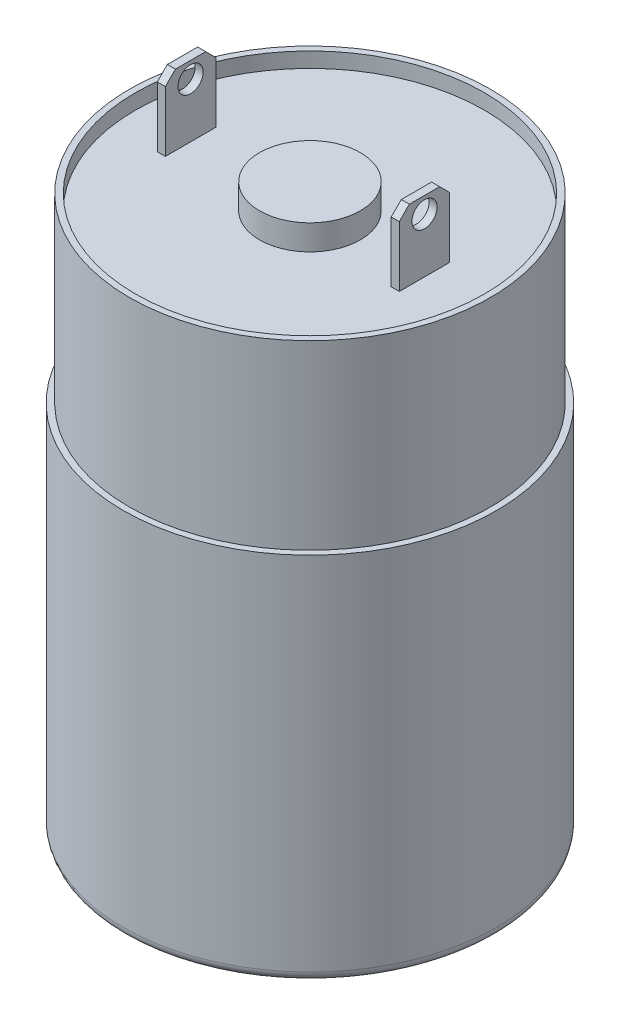
ISO-10303-21;
HEADER;
FILE_DESCRIPTION(('STEP AP214'),'2;1');
FILE_NAME('part.step','',(''),(''),'','','');
FILE_SCHEMA(('AUTOMOTIVE_DESIGN { 1 0 10303 214 1 1 1 1 }'));
ENDSEC;
DATA;
#1=APPLICATION_CONTEXT('core data for automotive mechanical design processes');
#2=APPLICATION_PROTOCOL_DEFINITION('international standard','automotive_design',2000,#1);
#3=PRODUCT_CONTEXT('',#1,'mechanical');
#4=PRODUCT('Part','Part','',(#3));
#5=PRODUCT_RELATED_PRODUCT_CATEGORY('part','',(#4));
#6=PRODUCT_DEFINITION_FORMATION('','',#4);
#7=PRODUCT_DEFINITION_CONTEXT('part definition',#1,'design');
#8=PRODUCT_DEFINITION('design','',#6,#7);
#9=PRODUCT_DEFINITION_SHAPE('','',#8);
#10=(LENGTH_UNIT() NAMED_UNIT(*) SI_UNIT(.MILLI.,.METRE.));
#11=(NAMED_UNIT(*) PLANE_ANGLE_UNIT() SI_UNIT($,.RADIAN.));
#12=(NAMED_UNIT(*) SI_UNIT($,.STERADIAN.) SOLID_ANGLE_UNIT());
#13=UNCERTAINTY_MEASURE_WITH_UNIT(LENGTH_MEASURE(1.E-05),#10,'distance_accuracy_value','');
#14=(GEOMETRIC_REPRESENTATION_CONTEXT(3) GLOBAL_UNCERTAINTY_ASSIGNED_CONTEXT((#13)) GLOBAL_UNIT_ASSIGNED_CONTEXT((#10,
#11,#12)) REPRESENTATION_CONTEXT('',''));
#15=CARTESIAN_POINT('',(0.,0.,0.));
#16=DIRECTION('',(0.,0.,1.));
#17=DIRECTION('',(1.,0.,0.));
#18=AXIS2_PLACEMENT_3D('',#15,#16,#17);
#19=CARTESIAN_POINT('',(0.,18.4,0.));
#20=DIRECTION('',(0.,-1.,0.));
#21=DIRECTION('',(0.,0.,-1.));
#22=AXIS2_PLACEMENT_3D('',#19,#20,#21);
#23=CYLINDRICAL_SURFACE('',#22,18.5);
#24=CARTESIAN_POINT('',(0.,-17.4,0.));
#25=DIRECTION('',(0.,1.,0.));
#26=DIRECTION('',(0.,0.,1.));
#27=AXIS2_PLACEMENT_3D('',#24,#25,#26);
#28=CIRCLE('',#27,18.5);
#29=CARTESIAN_POINT('',(0.,-17.4,18.5));
#30=VERTEX_POINT('',#29);
#31=EDGE_CURVE('E42',#30,#30,#28,.T.);
#32=ORIENTED_EDGE('',*,*,#31,.T.);
#33=EDGE_LOOP('',(#32));
#34=FACE_BOUND('',#33,.T.);
#35=CARTESIAN_POINT('',(0.,18.4,0.));
#36=DIRECTION('',(0.,1.,0.));
#37=DIRECTION('',(0.,0.,1.));
#38=AXIS2_PLACEMENT_3D('',#35,#36,#37);
#39=CIRCLE('',#38,18.5);
#40=CARTESIAN_POINT('',(0.,18.4,18.5));
#41=VERTEX_POINT('',#40);
#42=EDGE_CURVE('E208',#41,#41,#39,.T.);
#43=ORIENTED_EDGE('',*,*,#42,.F.);
#44=EDGE_LOOP('',(#43));
#45=FACE_BOUND('',#44,.T.);
#46=ADVANCED_FACE('F34',(#34,#45),#23,.T.);
#47=CARTESIAN_POINT('',(0.,18.4,0.));
#48=DIRECTION('',(0.,1.,0.));
#49=DIRECTION('',(0.,0.,1.));
#50=AXIS2_PLACEMENT_3D('',#47,#48,#49);
#51=PLANE('',#50);
#52=CARTESIAN_POINT('',(0.,18.4,0.));
#53=DIRECTION('',(0.,1.,0.));
#54=DIRECTION('',(0.,0.,1.));
#55=AXIS2_PLACEMENT_3D('',#52,#53,#54);
#56=CIRCLE('',#55,17.9);
#57=CARTESIAN_POINT('',(0.,18.4,17.9));
#58=VERTEX_POINT('',#57);
#59=EDGE_CURVE('E202',#58,#58,#56,.T.);
#60=ORIENTED_EDGE('',*,*,#59,.F.);
#61=EDGE_LOOP('',(#60));
#62=FACE_BOUND('',#61,.T.);
#63=ORIENTED_EDGE('',*,*,#42,.T.);
#64=EDGE_LOOP('',(#63));
#65=FACE_BOUND('',#64,.T.);
#66=ADVANCED_FACE('F260',(#62,#65),#51,.T.);
#67=CARTESIAN_POINT('',(0.,-18.4,0.));
#68=DIRECTION('',(0.,1.,0.));
#69=DIRECTION('',(0.,0.,1.));
#70=AXIS2_PLACEMENT_3D('',#67,#68,#69);
#71=PLANE('',#70);
#72=CARTESIAN_POINT('',(0.,-18.4,0.));
#73=DIRECTION('',(0.,1.,0.));
#74=DIRECTION('',(0.,0.,1.));
#75=AXIS2_PLACEMENT_3D('',#72,#73,#74);
#76=CIRCLE('',#75,17.5);
#77=CARTESIAN_POINT('',(0.,-18.4,17.5));
#78=VERTEX_POINT('',#77);
#79=EDGE_CURVE('E11',#78,#78,#76,.F.);
#80=ORIENTED_EDGE('',*,*,#79,.T.);
#81=EDGE_LOOP('',(#80));
#82=FACE_BOUND('',#81,.T.);
#83=ADVANCED_FACE('F265',(#82),#71,.F.);
#84=CARTESIAN_POINT('',(0.,36.4,0.));
#85=DIRECTION('',(0.,-1.,0.));
#86=DIRECTION('',(0.,0.,-1.));
#87=AXIS2_PLACEMENT_3D('',#84,#85,#86);
#88=CYLINDRICAL_SURFACE('',#87,17.9);
#89=CARTESIAN_POINT('',(0.,36.4,0.));
#90=DIRECTION('',(0.,1.,0.));
#91=DIRECTION('',(0.,0.,1.));
#92=AXIS2_PLACEMENT_3D('',#89,#90,#91);
#93=CIRCLE('',#92,17.9);
#94=CARTESIAN_POINT('',(0.,36.4,17.9));
#95=VERTEX_POINT('',#94);
#96=EDGE_CURVE('E205',#95,#95,#93,.T.);
#97=ORIENTED_EDGE('',*,*,#96,.F.);
#98=EDGE_LOOP('',(#97));
#99=FACE_BOUND('',#98,.T.);
#100=ORIENTED_EDGE('',*,*,#59,.T.);
#101=EDGE_LOOP('',(#100));
#102=FACE_BOUND('',#101,.T.);
#103=ADVANCED_FACE('F360',(#99,#102),#88,.T.);
#104=CARTESIAN_POINT('',(0.,36.4,0.));
#105=DIRECTION('',(0.,1.,0.));
#106=DIRECTION('',(0.,0.,1.));
#107=AXIS2_PLACEMENT_3D('',#104,#105,#106);
#108=PLANE('',#107);
#109=CARTESIAN_POINT('',(0.,36.4,0.));
#110=DIRECTION('',(0.,1.,0.));
#111=DIRECTION('',(0.,0.,1.));
#112=AXIS2_PLACEMENT_3D('',#109,#110,#111);
#113=CIRCLE('',#112,17.3);
#114=CARTESIAN_POINT('',(0.,36.4,17.3));
#115=VERTEX_POINT('',#114);
#116=EDGE_CURVE('E196',#115,#115,#113,.T.);
#117=ORIENTED_EDGE('',*,*,#116,.F.);
#118=EDGE_LOOP('',(#117));
#119=FACE_BOUND('',#118,.T.);
#120=ORIENTED_EDGE('',*,*,#96,.T.);
#121=EDGE_LOOP('',(#120));
#122=FACE_BOUND('',#121,.T.);
#123=ADVANCED_FACE('F356',(#119,#122),#108,.T.);
#124=CARTESIAN_POINT('',(0.,34.9,0.));
#125=DIRECTION('',(0.,1.,0.));
#126=DIRECTION('',(0.,0.,1.));
#127=AXIS2_PLACEMENT_3D('',#124,#125,#126);
#128=CYLINDRICAL_SURFACE('',#127,17.3);
#129=CARTESIAN_POINT('',(0.,34.9,0.));
#130=DIRECTION('',(0.,1.,0.));
#131=DIRECTION('',(0.,0.,1.));
#132=AXIS2_PLACEMENT_3D('',#129,#130,#131);
#133=CIRCLE('',#132,17.3);
#134=CARTESIAN_POINT('',(0.,34.9,17.3));
#135=VERTEX_POINT('',#134);
#136=EDGE_CURVE('E199',#135,#135,#133,.T.);
#137=ORIENTED_EDGE('',*,*,#136,.F.);
#138=EDGE_LOOP('',(#137));
#139=FACE_BOUND('',#138,.T.);
#140=ORIENTED_EDGE('',*,*,#116,.T.);
#141=EDGE_LOOP('',(#140));
#142=FACE_BOUND('',#141,.T.);
#143=ADVANCED_FACE('F353',(#139,#142),#128,.F.);
#144=CARTESIAN_POINT('',(0.,34.9,0.));
#145=DIRECTION('',(0.,1.,0.));
#146=DIRECTION('',(0.,0.,1.));
#147=AXIS2_PLACEMENT_3D('',#144,#145,#146);
#148=PLANE('',#147);
#149=DIRECTION('',(0.,0.,-1.));
#150=VECTOR('',#149,1.);
#151=CARTESIAN_POINT('',(10.561081130441,34.9,0.));
#152=LINE('',#151,#150);
#153=CARTESIAN_POINT('',(10.561081130441,34.9,2.5));
#154=VERTEX_POINT('',#153);
#155=CARTESIAN_POINT('',(10.561081130441,34.9,-2.5));
#156=VERTEX_POINT('',#155);
#157=EDGE_CURVE('E137',#154,#156,#152,.T.);
#158=ORIENTED_EDGE('',*,*,#157,.T.);
#159=DIRECTION('',(-1.,0.,0.));
#160=VECTOR('',#159,1.);
#161=CARTESIAN_POINT('',(23.2,34.9,-2.5));
#162=LINE('',#161,#160);
#163=CARTESIAN_POINT('',(11.361081130441,34.9,-2.5));
#164=VERTEX_POINT('',#163);
#165=EDGE_CURVE('E150',#164,#156,#162,.T.);
#166=ORIENTED_EDGE('',*,*,#165,.F.);
#167=DIRECTION('',(0.,0.,-1.));
#168=VECTOR('',#167,1.);
#169=CARTESIAN_POINT('',(11.361081130441,34.9,0.));
#170=LINE('',#169,#168);
#171=CARTESIAN_POINT('',(11.361081130441,34.9,2.5));
#172=VERTEX_POINT('',#171);
#173=EDGE_CURVE('E148',#172,#164,#170,.T.);
#174=ORIENTED_EDGE('',*,*,#173,.F.);
#175=DIRECTION('',(-1.,0.,0.));
#176=VECTOR('',#175,1.);
#177=CARTESIAN_POINT('',(23.2,34.9,2.5));
#178=LINE('',#177,#176);
#179=EDGE_CURVE('E129',#172,#154,#178,.T.);
#180=ORIENTED_EDGE('',*,*,#179,.T.);
#181=EDGE_LOOP('',(#158,#166,#174,#180));
#182=FACE_BOUND('',#181,.T.);
#183=DIRECTION('',(0.,0.,-1.));
#184=VECTOR('',#183,1.);
#185=CARTESIAN_POINT('',(-12.638918869559,34.9,0.));
#186=LINE('',#185,#184);
#187=CARTESIAN_POINT('',(-12.638918869559,34.9,2.5));
#188=VERTEX_POINT('',#187);
#189=CARTESIAN_POINT('',(-12.638918869559,34.9,-2.5));
#190=VERTEX_POINT('',#189);
#191=EDGE_CURVE('E166',#188,#190,#186,.T.);
#192=ORIENTED_EDGE('',*,*,#191,.T.);
#193=DIRECTION('',(-1.,0.,0.));
#194=VECTOR('',#193,1.);
#195=CARTESIAN_POINT('',(0.,34.9,-2.5));
#196=LINE('',#195,#194);
#197=CARTESIAN_POINT('',(-11.838918869559,34.9,-2.5));
#198=VERTEX_POINT('',#197);
#199=EDGE_CURVE('E171',#198,#190,#196,.T.);
#200=ORIENTED_EDGE('',*,*,#199,.F.);
#201=DIRECTION('',(0.,0.,-1.));
#202=VECTOR('',#201,1.);
#203=CARTESIAN_POINT('',(-11.838918869559,34.9,0.));
#204=LINE('',#203,#202);
#205=CARTESIAN_POINT('',(-11.838918869559,34.9,2.5));
#206=VERTEX_POINT('',#205);
#207=EDGE_CURVE('E180',#206,#198,#204,.T.);
#208=ORIENTED_EDGE('',*,*,#207,.F.);
#209=DIRECTION('',(-1.,0.,0.));
#210=VECTOR('',#209,1.);
#211=CARTESIAN_POINT('',(0.,34.9,2.5));
#212=LINE('',#211,#210);
#213=EDGE_CURVE('E177',#206,#188,#212,.T.);
#214=ORIENTED_EDGE('',*,*,#213,.T.);
#215=EDGE_LOOP('',(#192,#200,#208,#214));
#216=FACE_BOUND('',#215,.T.);
#217=CARTESIAN_POINT('',(0.,34.9,0.));
#218=DIRECTION('',(0.,1.,0.));
#219=DIRECTION('',(0.,0.,1.));
#220=AXIS2_PLACEMENT_3D('',#217,#218,#219);
#221=CIRCLE('',#220,5.);
#222=CARTESIAN_POINT('',(0.,34.9,5.));
#223=VERTEX_POINT('',#222);
#224=EDGE_CURVE('E192',#223,#223,#221,.T.);
#225=ORIENTED_EDGE('',*,*,#224,.F.);
#226=EDGE_LOOP('',(#225));
#227=FACE_BOUND('',#226,.T.);
#228=ORIENTED_EDGE('',*,*,#136,.T.);
#229=EDGE_LOOP('',(#228));
#230=FACE_BOUND('',#229,.T.);
#231=ADVANCED_FACE('F145',(#182,#216,#227,#230),#148,.T.);
#232=CARTESIAN_POINT('',(0.,37.4,0.));
#233=DIRECTION('',(0.,-1.,0.));
#234=DIRECTION('',(0.,0.,-1.));
#235=AXIS2_PLACEMENT_3D('',#232,#233,#234);
#236=CYLINDRICAL_SURFACE('',#235,5.);
#237=CARTESIAN_POINT('',(0.,37.4,0.));
#238=DIRECTION('',(0.,1.,0.));
#239=DIRECTION('',(0.,0.,1.));
#240=AXIS2_PLACEMENT_3D('',#237,#238,#239);
#241=CIRCLE('',#240,5.);
#242=CARTESIAN_POINT('',(0.,37.4,5.));
#243=VERTEX_POINT('',#242);
#244=EDGE_CURVE('E193',#243,#243,#241,.T.);
#245=ORIENTED_EDGE('',*,*,#244,.F.);
#246=EDGE_LOOP('',(#245));
#247=FACE_BOUND('',#246,.T.);
#248=ORIENTED_EDGE('',*,*,#224,.T.);
#249=EDGE_LOOP('',(#248));
#250=FACE_BOUND('',#249,.T.);
#251=ADVANCED_FACE('F346',(#247,#250),#236,.T.);
#252=CARTESIAN_POINT('',(0.,37.4,0.));
#253=DIRECTION('',(0.,1.,0.));
#254=DIRECTION('',(0.,0.,1.));
#255=AXIS2_PLACEMENT_3D('',#252,#253,#254);
#256=PLANE('',#255);
#257=ORIENTED_EDGE('',*,*,#244,.T.);
#258=EDGE_LOOP('',(#257));
#259=FACE_BOUND('',#258,.T.);
#260=ADVANCED_FACE('F342',(#259),#256,.T.);
#261=CARTESIAN_POINT('',(-12.638918869559,41.9,0.));
#262=DIRECTION('',(-1.,0.,0.));
#263=DIRECTION('',(0.,0.,1.));
#264=AXIS2_PLACEMENT_3D('',#261,#262,#263);
#265=PLANE('',#264);
#266=CARTESIAN_POINT('',(-12.638918869559,40.2854740989314,0.));
#267=DIRECTION('',(-1.,0.,0.));
#268=DIRECTION('',(0.,0.,1.));
#269=AXIS2_PLACEMENT_3D('',#266,#267,#268);
#270=CIRCLE('',#269,1.25);
#271=CARTESIAN_POINT('',(-12.638918869559,40.2854740989314,1.25));
#272=VERTEX_POINT('',#271);
#273=EDGE_CURVE('E163',#272,#272,#270,.T.);
#274=ORIENTED_EDGE('',*,*,#273,.F.);
#275=EDGE_LOOP('',(#274));
#276=FACE_BOUND('',#275,.T.);
#277=DIRECTION('',(0.,0.,-1.));
#278=VECTOR('',#277,1.);
#279=CARTESIAN_POINT('',(-12.638918869559,41.9,0.));
#280=LINE('',#279,#278);
#281=CARTESIAN_POINT('',(-12.638918869559,41.9,1.5));
#282=VERTEX_POINT('',#281);
#283=CARTESIAN_POINT('',(-12.638918869559,41.9,-1.5));
#284=VERTEX_POINT('',#283);
#285=EDGE_CURVE('E167',#282,#284,#280,.T.);
#286=ORIENTED_EDGE('',*,*,#285,.T.);
#287=DIRECTION('',(0.,-0.70710678118655,-0.707106781186545));
#288=VECTOR('',#287,1.);
#289=CARTESIAN_POINT('',(-12.638918869559,42.65,-0.750000000000005));
#290=LINE('',#289,#288);
#291=CARTESIAN_POINT('',(-12.638918869559,40.9,-2.5));
#292=VERTEX_POINT('',#291);
#293=EDGE_CURVE('E225',#284,#292,#290,.T.);
#294=ORIENTED_EDGE('',*,*,#293,.T.);
#295=DIRECTION('',(0.,-1.,0.));
#296=VECTOR('',#295,1.);
#297=CARTESIAN_POINT('',(-12.638918869559,41.9,-2.5));
#298=LINE('',#297,#296);
#299=EDGE_CURVE('E174',#292,#190,#298,.T.);
#300=ORIENTED_EDGE('',*,*,#299,.T.);
#301=ORIENTED_EDGE('',*,*,#191,.F.);
#302=DIRECTION('',(0.,-1.,0.));
#303=VECTOR('',#302,1.);
#304=CARTESIAN_POINT('',(-12.638918869559,41.9,2.5));
#305=LINE('',#304,#303);
#306=CARTESIAN_POINT('',(-12.638918869559,40.9,2.5));
#307=VERTEX_POINT('',#306);
#308=EDGE_CURVE('E190',#307,#188,#305,.T.);
#309=ORIENTED_EDGE('',*,*,#308,.F.);
#310=DIRECTION('',(0.,-0.707106781186543,0.707106781186552));
#311=VECTOR('',#310,1.);
#312=CARTESIAN_POINT('',(-12.638918869559,42.65,0.749999999999989));
#313=LINE('',#312,#311);
#314=EDGE_CURVE('E216',#307,#282,#313,.F.);
#315=ORIENTED_EDGE('',*,*,#314,.T.);
#316=EDGE_LOOP('',(#286,#294,#300,#301,#309,#315));
#317=FACE_BOUND('',#316,.T.);
#318=ADVANCED_FACE('F338',(#276,#317),#265,.T.);
#319=CARTESIAN_POINT('',(0.,41.9,2.5));
#320=DIRECTION('',(0.,0.,1.));
#321=DIRECTION('',(1.,0.,0.));
#322=AXIS2_PLACEMENT_3D('',#319,#320,#321);
#323=PLANE('',#322);
#324=DIRECTION('',(0.,-1.,0.));
#325=VECTOR('',#324,1.);
#326=CARTESIAN_POINT('',(-11.838918869559,41.9,2.5));
#327=LINE('',#326,#325);
#328=CARTESIAN_POINT('',(-11.838918869559,40.9,2.5));
#329=VERTEX_POINT('',#328);
#330=EDGE_CURVE('E188',#329,#206,#327,.T.);
#331=ORIENTED_EDGE('',*,*,#330,.F.);
#332=DIRECTION('',(-1.,0.,0.));
#333=VECTOR('',#332,1.);
#334=CARTESIAN_POINT('',(0.,40.9,2.5));
#335=LINE('',#334,#333);
#336=EDGE_CURVE('E213',#329,#307,#335,.T.);
#337=ORIENTED_EDGE('',*,*,#336,.T.);
#338=ORIENTED_EDGE('',*,*,#308,.T.);
#339=ORIENTED_EDGE('',*,*,#213,.F.);
#340=EDGE_LOOP('',(#331,#337,#338,#339));
#341=FACE_BOUND('',#340,.T.);
#342=ADVANCED_FACE('F334',(#341),#323,.T.);
#343=CARTESIAN_POINT('',(-11.838918869559,41.9,0.));
#344=DIRECTION('',(-1.,0.,0.));
#345=DIRECTION('',(0.,0.,1.));
#346=AXIS2_PLACEMENT_3D('',#343,#344,#345);
#347=PLANE('',#346);
#348=CARTESIAN_POINT('',(-11.838918869559,40.2854740989314,0.));
#349=DIRECTION('',(1.,0.,0.));
#350=DIRECTION('',(0.,0.,-1.));
#351=AXIS2_PLACEMENT_3D('',#348,#349,#350);
#352=CIRCLE('',#351,1.25);
#353=CARTESIAN_POINT('',(-11.838918869559,40.2854740989314,-1.25));
#354=VERTEX_POINT('',#353);
#355=EDGE_CURVE('E133',#354,#354,#352,.T.);
#356=ORIENTED_EDGE('',*,*,#355,.F.);
#357=EDGE_LOOP('',(#356));
#358=FACE_BOUND('',#357,.T.);
#359=DIRECTION('',(0.,-1.,0.));
#360=VECTOR('',#359,1.);
#361=CARTESIAN_POINT('',(-11.838918869559,41.9,-2.5));
#362=LINE('',#361,#360);
#363=CARTESIAN_POINT('',(-11.838918869559,40.9,-2.5));
#364=VERTEX_POINT('',#363);
#365=EDGE_CURVE('E186',#364,#198,#362,.T.);
#366=ORIENTED_EDGE('',*,*,#365,.F.);
#367=DIRECTION('',(0.,0.70710678118655,0.707106781186545));
#368=VECTOR('',#367,1.);
#369=CARTESIAN_POINT('',(-11.838918869559,41.9,-1.5));
#370=LINE('',#369,#368);
#371=CARTESIAN_POINT('',(-11.838918869559,41.9,-1.5));
#372=VERTEX_POINT('',#371);
#373=EDGE_CURVE('E229',#364,#372,#370,.T.);
#374=ORIENTED_EDGE('',*,*,#373,.T.);
#375=DIRECTION('',(0.,0.,-1.));
#376=VECTOR('',#375,1.);
#377=CARTESIAN_POINT('',(-11.838918869559,41.9,0.));
#378=LINE('',#377,#376);
#379=CARTESIAN_POINT('',(-11.838918869559,41.9,1.5));
#380=VERTEX_POINT('',#379);
#381=EDGE_CURVE('E170',#380,#372,#378,.T.);
#382=ORIENTED_EDGE('',*,*,#381,.F.);
#383=DIRECTION('',(0.,0.707106781186543,-0.707106781186552));
#384=VECTOR('',#383,1.);
#385=CARTESIAN_POINT('',(-11.838918869559,40.9,2.5));
#386=LINE('',#385,#384);
#387=EDGE_CURVE('E220',#380,#329,#386,.F.);
#388=ORIENTED_EDGE('',*,*,#387,.T.);
#389=ORIENTED_EDGE('',*,*,#330,.T.);
#390=ORIENTED_EDGE('',*,*,#207,.T.);
#391=EDGE_LOOP('',(#366,#374,#382,#388,#389,#390));
#392=FACE_BOUND('',#391,.T.);
#393=ADVANCED_FACE('F330',(#358,#392),#347,.F.);
#394=CARTESIAN_POINT('',(0.,41.9,-2.5));
#395=DIRECTION('',(0.,0.,1.));
#396=DIRECTION('',(1.,0.,0.));
#397=AXIS2_PLACEMENT_3D('',#394,#395,#396);
#398=PLANE('',#397);
#399=ORIENTED_EDGE('',*,*,#299,.F.);
#400=DIRECTION('',(1.,0.,0.));
#401=VECTOR('',#400,1.);
#402=CARTESIAN_POINT('',(-11.838918869559,40.9,-2.5));
#403=LINE('',#402,#401);
#404=EDGE_CURVE('E227',#292,#364,#403,.T.);
#405=ORIENTED_EDGE('',*,*,#404,.T.);
#406=ORIENTED_EDGE('',*,*,#365,.T.);
#407=ORIENTED_EDGE('',*,*,#199,.T.);
#408=EDGE_LOOP('',(#399,#405,#406,#407));
#409=FACE_BOUND('',#408,.T.);
#410=ADVANCED_FACE('F326',(#409),#398,.F.);
#411=CARTESIAN_POINT('',(0.,41.9,0.));
#412=DIRECTION('',(0.,1.,0.));
#413=DIRECTION('',(0.,0.,1.));
#414=AXIS2_PLACEMENT_3D('',#411,#412,#413);
#415=PLANE('',#414);
#416=ORIENTED_EDGE('',*,*,#381,.T.);
#417=DIRECTION('',(-1.,0.,0.));
#418=VECTOR('',#417,1.);
#419=CARTESIAN_POINT('',(-12.638918869559,41.9,-1.5));
#420=LINE('',#419,#418);
#421=EDGE_CURVE('E222',#372,#284,#420,.T.);
#422=ORIENTED_EDGE('',*,*,#421,.T.);
#423=ORIENTED_EDGE('',*,*,#285,.F.);
#424=DIRECTION('',(1.,0.,0.));
#425=VECTOR('',#424,1.);
#426=CARTESIAN_POINT('',(0.,41.9,1.5));
#427=LINE('',#426,#425);
#428=EDGE_CURVE('E218',#282,#380,#427,.T.);
#429=ORIENTED_EDGE('',*,*,#428,.T.);
#430=EDGE_LOOP('',(#416,#422,#423,#429));
#431=FACE_BOUND('',#430,.T.);
#432=ADVANCED_FACE('F274',(#431),#415,.T.);
#433=CARTESIAN_POINT('',(0.,40.9,2.5));
#434=DIRECTION('',(0.,-0.707106781186552,-0.707106781186543));
#435=DIRECTION('',(-1.,0.,0.));
#436=AXIS2_PLACEMENT_3D('',#433,#434,#435);
#437=PLANE('',#436);
#438=ORIENTED_EDGE('',*,*,#387,.F.);
#439=ORIENTED_EDGE('',*,*,#428,.F.);
#440=ORIENTED_EDGE('',*,*,#314,.F.);
#441=ORIENTED_EDGE('',*,*,#336,.F.);
#442=EDGE_LOOP('',(#438,#439,#440,#441));
#443=FACE_BOUND('',#442,.T.);
#444=ADVANCED_FACE('F270',(#443),#437,.F.);
#445=CARTESIAN_POINT('',(0.,41.9,-1.5));
#446=DIRECTION('',(0.,0.707106781186545,-0.70710678118655));
#447=DIRECTION('',(1.,0.,0.));
#448=AXIS2_PLACEMENT_3D('',#445,#446,#447);
#449=PLANE('',#448);
#450=ORIENTED_EDGE('',*,*,#373,.F.);
#451=ORIENTED_EDGE('',*,*,#404,.F.);
#452=ORIENTED_EDGE('',*,*,#293,.F.);
#453=ORIENTED_EDGE('',*,*,#421,.F.);
#454=EDGE_LOOP('',(#450,#451,#452,#453));
#455=FACE_BOUND('',#454,.T.);
#456=ADVANCED_FACE('F273',(#455),#449,.T.);
#457=CARTESIAN_POINT('',(-18.838918869559,40.2854740989314,0.));
#458=DIRECTION('',(1.,0.,0.));
#459=DIRECTION('',(0.,0.,-1.));
#460=AXIS2_PLACEMENT_3D('',#457,#458,#459);
#461=CYLINDRICAL_SURFACE('',#460,1.25);
#462=ORIENTED_EDGE('',*,*,#273,.T.);
#463=EDGE_LOOP('',(#462));
#464=FACE_BOUND('',#463,.T.);
#465=ORIENTED_EDGE('',*,*,#355,.T.);
#466=EDGE_LOOP('',(#465));
#467=FACE_BOUND('',#466,.T.);
#468=ADVANCED_FACE('F278',(#464,#467),#461,.F.);
#469=CARTESIAN_POINT('',(10.561081130441,41.9,0.));
#470=DIRECTION('',(-1.,0.,0.));
#471=DIRECTION('',(0.,0.,1.));
#472=AXIS2_PLACEMENT_3D('',#469,#470,#471);
#473=PLANE('',#472);
#474=CARTESIAN_POINT('',(10.561081130441,40.2854740989314,0.));
#475=DIRECTION('',(-1.,0.,0.));
#476=DIRECTION('',(0.,0.,1.));
#477=AXIS2_PLACEMENT_3D('',#474,#475,#476);
#478=CIRCLE('',#477,1.25);
#479=CARTESIAN_POINT('',(10.561081130441,40.2854740989314,1.25));
#480=VERTEX_POINT('',#479);
#481=EDGE_CURVE('E143',#480,#480,#478,.T.);
#482=ORIENTED_EDGE('',*,*,#481,.F.);
#483=EDGE_LOOP('',(#482));
#484=FACE_BOUND('',#483,.T.);
#485=DIRECTION('',(0.,0.,-1.));
#486=VECTOR('',#485,1.);
#487=CARTESIAN_POINT('',(10.561081130441,41.9,0.));
#488=LINE('',#487,#486);
#489=CARTESIAN_POINT('',(10.561081130441,41.9,1.5));
#490=VERTEX_POINT('',#489);
#491=CARTESIAN_POINT('',(10.561081130441,41.9,-1.5));
#492=VERTEX_POINT('',#491);
#493=EDGE_CURVE('E155',#490,#492,#488,.T.);
#494=ORIENTED_EDGE('',*,*,#493,.T.);
#495=DIRECTION('',(0.,-0.70710678118655,-0.707106781186545));
#496=VECTOR('',#495,1.);
#497=CARTESIAN_POINT('',(10.561081130441,42.65,-0.750000000000005));
#498=LINE('',#497,#496);
#499=CARTESIAN_POINT('',(10.561081130441,40.9,-2.5));
#500=VERTEX_POINT('',#499);
#501=EDGE_CURVE('E57',#492,#500,#498,.T.);
#502=ORIENTED_EDGE('',*,*,#501,.T.);
#503=DIRECTION('',(0.,-1.,0.));
#504=VECTOR('',#503,1.);
#505=CARTESIAN_POINT('',(10.561081130441,41.9,-2.5));
#506=LINE('',#505,#504);
#507=EDGE_CURVE('E139',#500,#156,#506,.T.);
#508=ORIENTED_EDGE('',*,*,#507,.T.);
#509=ORIENTED_EDGE('',*,*,#157,.F.);
#510=DIRECTION('',(0.,-1.,0.));
#511=VECTOR('',#510,1.);
#512=CARTESIAN_POINT('',(10.561081130441,41.9,2.5));
#513=LINE('',#512,#511);
#514=CARTESIAN_POINT('',(10.561081130441,40.9,2.5));
#515=VERTEX_POINT('',#514);
#516=EDGE_CURVE('E124',#515,#154,#513,.T.);
#517=ORIENTED_EDGE('',*,*,#516,.F.);
#518=DIRECTION('',(0.,-0.707106781186543,0.707106781186552));
#519=VECTOR('',#518,1.);
#520=CARTESIAN_POINT('',(10.561081130441,42.65,0.749999999999989));
#521=LINE('',#520,#519);
#522=EDGE_CURVE('E232',#515,#490,#521,.F.);
#523=ORIENTED_EDGE('',*,*,#522,.T.);
#524=EDGE_LOOP('',(#494,#502,#508,#509,#517,#523));
#525=FACE_BOUND('',#524,.T.);
#526=ADVANCED_FACE('F138',(#484,#525),#473,.T.);
#527=CARTESIAN_POINT('',(23.2,41.9,2.5));
#528=DIRECTION('',(0.,0.,1.));
#529=DIRECTION('',(1.,0.,0.));
#530=AXIS2_PLACEMENT_3D('',#527,#528,#529);
#531=PLANE('',#530);
#532=DIRECTION('',(0.,-1.,0.));
#533=VECTOR('',#532,1.);
#534=CARTESIAN_POINT('',(11.361081130441,41.9,2.5));
#535=LINE('',#534,#533);
#536=CARTESIAN_POINT('',(11.361081130441,40.9,2.5));
#537=VERTEX_POINT('',#536);
#538=EDGE_CURVE('E134',#537,#172,#535,.T.);
#539=ORIENTED_EDGE('',*,*,#538,.F.);
#540=DIRECTION('',(-1.,0.,0.));
#541=VECTOR('',#540,1.);
#542=CARTESIAN_POINT('',(23.2,40.9,2.5));
#543=LINE('',#542,#541);
#544=EDGE_CURVE('E132',#537,#515,#543,.T.);
#545=ORIENTED_EDGE('',*,*,#544,.T.);
#546=ORIENTED_EDGE('',*,*,#516,.T.);
#547=ORIENTED_EDGE('',*,*,#179,.F.);
#548=EDGE_LOOP('',(#539,#545,#546,#547));
#549=FACE_BOUND('',#548,.T.);
#550=ADVANCED_FACE('F127',(#549),#531,.T.);
#551=CARTESIAN_POINT('',(11.361081130441,41.9,0.));
#552=DIRECTION('',(-1.,0.,0.));
#553=DIRECTION('',(0.,0.,1.));
#554=AXIS2_PLACEMENT_3D('',#551,#552,#553);
#555=PLANE('',#554);
#556=CARTESIAN_POINT('',(11.361081130441,40.2854740989314,0.));
#557=DIRECTION('',(1.,0.,0.));
#558=DIRECTION('',(0.,0.,-1.));
#559=AXIS2_PLACEMENT_3D('',#556,#557,#558);
#560=CIRCLE('',#559,1.25);
#561=CARTESIAN_POINT('',(11.361081130441,40.2854740989314,-1.25));
#562=VERTEX_POINT('',#561);
#563=EDGE_CURVE('E302',#562,#562,#560,.T.);
#564=ORIENTED_EDGE('',*,*,#563,.F.);
#565=EDGE_LOOP('',(#564));
#566=FACE_BOUND('',#565,.T.);
#567=DIRECTION('',(0.,-1.,0.));
#568=VECTOR('',#567,1.);
#569=CARTESIAN_POINT('',(11.361081130441,41.9,-2.5));
#570=LINE('',#569,#568);
#571=CARTESIAN_POINT('',(11.361081130441,40.9,-2.5));
#572=VERTEX_POINT('',#571);
#573=EDGE_CURVE('E157',#572,#164,#570,.T.);
#574=ORIENTED_EDGE('',*,*,#573,.F.);
#575=DIRECTION('',(0.,0.70710678118655,0.707106781186545));
#576=VECTOR('',#575,1.);
#577=CARTESIAN_POINT('',(11.361081130441,41.9,-1.5));
#578=LINE('',#577,#576);
#579=CARTESIAN_POINT('',(11.361081130441,41.9,-1.5));
#580=VERTEX_POINT('',#579);
#581=EDGE_CURVE('E243',#572,#580,#578,.T.);
#582=ORIENTED_EDGE('',*,*,#581,.T.);
#583=DIRECTION('',(0.,0.,-1.));
#584=VECTOR('',#583,1.);
#585=CARTESIAN_POINT('',(11.361081130441,41.9,0.));
#586=LINE('',#585,#584);
#587=CARTESIAN_POINT('',(11.361081130441,41.9,1.5));
#588=VERTEX_POINT('',#587);
#589=EDGE_CURVE('E158',#588,#580,#586,.T.);
#590=ORIENTED_EDGE('',*,*,#589,.F.);
#591=DIRECTION('',(0.,0.707106781186543,-0.707106781186552));
#592=VECTOR('',#591,1.);
#593=CARTESIAN_POINT('',(11.361081130441,40.9,2.5));
#594=LINE('',#593,#592);
#595=EDGE_CURVE('E236',#588,#537,#594,.F.);
#596=ORIENTED_EDGE('',*,*,#595,.T.);
#597=ORIENTED_EDGE('',*,*,#538,.T.);
#598=ORIENTED_EDGE('',*,*,#173,.T.);
#599=EDGE_LOOP('',(#574,#582,#590,#596,#597,#598));
#600=FACE_BOUND('',#599,.T.);
#601=ADVANCED_FACE('F293',(#566,#600),#555,.F.);
#602=CARTESIAN_POINT('',(23.2,41.9,-2.5));
#603=DIRECTION('',(0.,0.,1.));
#604=DIRECTION('',(1.,0.,0.));
#605=AXIS2_PLACEMENT_3D('',#602,#603,#604);
#606=PLANE('',#605);
#607=ORIENTED_EDGE('',*,*,#507,.F.);
#608=DIRECTION('',(1.,0.,0.));
#609=VECTOR('',#608,1.);
#610=CARTESIAN_POINT('',(11.361081130441,40.9,-2.5));
#611=LINE('',#610,#609);
#612=EDGE_CURVE('E49',#500,#572,#611,.T.);
#613=ORIENTED_EDGE('',*,*,#612,.T.);
#614=ORIENTED_EDGE('',*,*,#573,.T.);
#615=ORIENTED_EDGE('',*,*,#165,.T.);
#616=EDGE_LOOP('',(#607,#613,#614,#615));
#617=FACE_BOUND('',#616,.T.);
#618=ADVANCED_FACE('F308',(#617),#606,.F.);
#619=CARTESIAN_POINT('',(23.2,41.9,0.));
#620=DIRECTION('',(0.,1.,0.));
#621=DIRECTION('',(0.,0.,1.));
#622=AXIS2_PLACEMENT_3D('',#619,#620,#621);
#623=PLANE('',#622);
#624=ORIENTED_EDGE('',*,*,#589,.T.);
#625=DIRECTION('',(-1.,0.,0.));
#626=VECTOR('',#625,1.);
#627=CARTESIAN_POINT('',(10.561081130441,41.9,-1.5));
#628=LINE('',#627,#626);
#629=EDGE_CURVE('E238',#580,#492,#628,.T.);
#630=ORIENTED_EDGE('',*,*,#629,.T.);
#631=ORIENTED_EDGE('',*,*,#493,.F.);
#632=DIRECTION('',(1.,0.,0.));
#633=VECTOR('',#632,1.);
#634=CARTESIAN_POINT('',(23.2,41.9,1.5));
#635=LINE('',#634,#633);
#636=EDGE_CURVE('E234',#490,#588,#635,.T.);
#637=ORIENTED_EDGE('',*,*,#636,.T.);
#638=EDGE_LOOP('',(#624,#630,#631,#637));
#639=FACE_BOUND('',#638,.T.);
#640=ADVANCED_FACE('F282',(#639),#623,.T.);
#641=CARTESIAN_POINT('',(23.2,40.9,2.5));
#642=DIRECTION('',(0.,-0.707106781186552,-0.707106781186543));
#643=DIRECTION('',(-1.,0.,0.));
#644=AXIS2_PLACEMENT_3D('',#641,#642,#643);
#645=PLANE('',#644);
#646=ORIENTED_EDGE('',*,*,#595,.F.);
#647=ORIENTED_EDGE('',*,*,#636,.F.);
#648=ORIENTED_EDGE('',*,*,#522,.F.);
#649=ORIENTED_EDGE('',*,*,#544,.F.);
#650=EDGE_LOOP('',(#646,#647,#648,#649));
#651=FACE_BOUND('',#650,.T.);
#652=ADVANCED_FACE('F280',(#651),#645,.F.);
#653=CARTESIAN_POINT('',(23.2,41.9,-1.5));
#654=DIRECTION('',(0.,0.707106781186545,-0.70710678118655));
#655=DIRECTION('',(1.,0.,0.));
#656=AXIS2_PLACEMENT_3D('',#653,#654,#655);
#657=PLANE('',#656);
#658=ORIENTED_EDGE('',*,*,#581,.F.);
#659=ORIENTED_EDGE('',*,*,#612,.F.);
#660=ORIENTED_EDGE('',*,*,#501,.F.);
#661=ORIENTED_EDGE('',*,*,#629,.F.);
#662=EDGE_LOOP('',(#658,#659,#660,#661));
#663=FACE_BOUND('',#662,.T.);
#664=ADVANCED_FACE('F255',(#663),#657,.T.);
#665=CARTESIAN_POINT('',(4.36108113044101,40.2854740989314,0.));
#666=DIRECTION('',(1.,0.,0.));
#667=DIRECTION('',(0.,0.,-1.));
#668=AXIS2_PLACEMENT_3D('',#665,#666,#667);
#669=CYLINDRICAL_SURFACE('',#668,1.25);
#670=ORIENTED_EDGE('',*,*,#481,.T.);
#671=EDGE_LOOP('',(#670));
#672=FACE_BOUND('',#671,.T.);
#673=ORIENTED_EDGE('',*,*,#563,.T.);
#674=EDGE_LOOP('',(#673));
#675=FACE_BOUND('',#674,.T.);
#676=ADVANCED_FACE('F250',(#672,#675),#669,.F.);
#677=CARTESIAN_POINT('',(0.,-17.4,0.));
#678=DIRECTION('',(0.,1.,0.));
#679=DIRECTION('',(0.,0.,1.));
#680=AXIS2_PLACEMENT_3D('',#677,#678,#679);
#681=TOROIDAL_SURFACE('',#680,17.5,1.);
#682=ORIENTED_EDGE('',*,*,#79,.F.);
#683=EDGE_LOOP('',(#682));
#684=FACE_BOUND('',#683,.T.);
#685=ORIENTED_EDGE('',*,*,#31,.F.);
#686=EDGE_LOOP('',(#685));
#687=FACE_BOUND('',#686,.T.);
#688=ADVANCED_FACE('F36',(#684,#687),#681,.T.);
#689=CLOSED_SHELL('',(#46,#66,#83,#103,#123,#143,#231,#251,#260,#318,#342,#393,#410,#432,#444,
#456,#468,#526,#550,#601,#618,#640,#652,#664,#676,#688));
#690=MANIFOLD_SOLID_BREP('B2',#689);
#691=ADVANCED_BREP_SHAPE_REPRESENTATION('',(#18,#690),#14);
#692=SHAPE_DEFINITION_REPRESENTATION(#9,#691);
ENDSEC;
END-ISO-10303-21;
